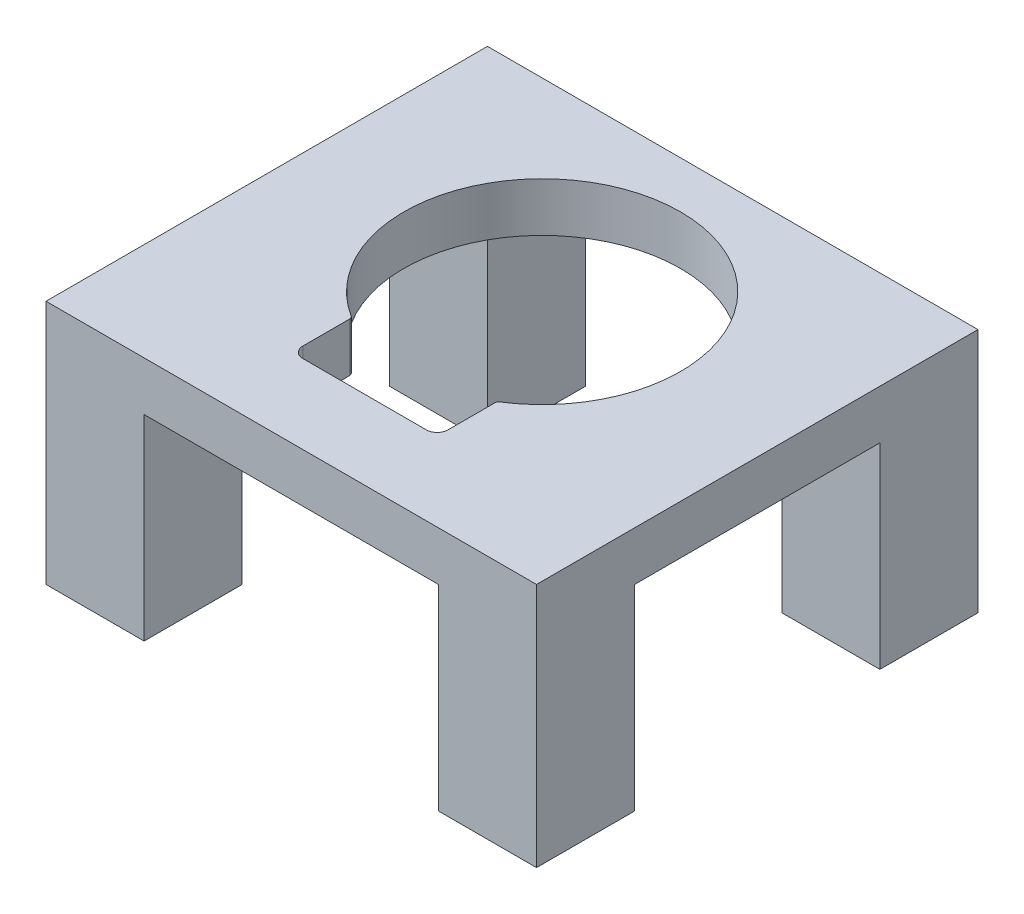
ISO-10303-21;
HEADER;
FILE_DESCRIPTION(('STEP AP214'),'2;1');
FILE_NAME('part.step','',(''),(''),'','','');
FILE_SCHEMA(('AUTOMOTIVE_DESIGN { 1 0 10303 214 1 1 1 1 }'));
ENDSEC;
DATA;
#1=APPLICATION_CONTEXT('core data for automotive mechanical design processes');
#2=APPLICATION_PROTOCOL_DEFINITION('international standard','automotive_design',2000,#1);
#3=PRODUCT_CONTEXT('',#1,'mechanical');
#4=PRODUCT('Part','Part','',(#3));
#5=PRODUCT_RELATED_PRODUCT_CATEGORY('part','',(#4));
#6=PRODUCT_DEFINITION_FORMATION('','',#4);
#7=PRODUCT_DEFINITION_CONTEXT('part definition',#1,'design');
#8=PRODUCT_DEFINITION('design','',#6,#7);
#9=PRODUCT_DEFINITION_SHAPE('','',#8);
#10=(LENGTH_UNIT() NAMED_UNIT(*) SI_UNIT(.MILLI.,.METRE.));
#11=(NAMED_UNIT(*) PLANE_ANGLE_UNIT() SI_UNIT($,.RADIAN.));
#12=(NAMED_UNIT(*) SI_UNIT($,.STERADIAN.) SOLID_ANGLE_UNIT());
#13=UNCERTAINTY_MEASURE_WITH_UNIT(LENGTH_MEASURE(1.E-05),#10,'distance_accuracy_value','');
#14=(GEOMETRIC_REPRESENTATION_CONTEXT(3) GLOBAL_UNCERTAINTY_ASSIGNED_CONTEXT((#13)) GLOBAL_UNIT_ASSIGNED_CONTEXT((#10,
#11,#12)) REPRESENTATION_CONTEXT('',''));
#15=CARTESIAN_POINT('',(0.,0.,0.));
#16=DIRECTION('',(0.,0.,1.));
#17=DIRECTION('',(1.,0.,0.));
#18=AXIS2_PLACEMENT_3D('',#15,#16,#17);
#19=CARTESIAN_POINT('',(0.,0.,0.));
#20=DIRECTION('',(0.,1.,0.));
#21=DIRECTION('',(0.,0.,1.));
#22=AXIS2_PLACEMENT_3D('',#19,#20,#21);
#23=PLANE('',#22);
#24=CARTESIAN_POINT('',(-6.3,0.,15.));
#25=DIRECTION('',(0.,1.,0.));
#26=DIRECTION('',(0.,0.,1.));
#27=AXIS2_PLACEMENT_3D('',#24,#25,#26);
#28=CIRCLE('',#27,1.1);
#29=CARTESIAN_POINT('',(-7.4,0.,15.));
#30=VERTEX_POINT('',#29);
#31=CARTESIAN_POINT('',(-6.3,0.,16.1));
#32=VERTEX_POINT('',#31);
#33=EDGE_CURVE('E291',#30,#32,#28,.T.);
#34=ORIENTED_EDGE('',*,*,#33,.T.);
#35=DIRECTION('',(1.,0.,0.));
#36=VECTOR('',#35,1.);
#37=CARTESIAN_POINT('',(6.3,0.,16.1));
#38=LINE('',#37,#36);
#39=CARTESIAN_POINT('',(6.3,0.,16.1));
#40=VERTEX_POINT('',#39);
#41=EDGE_CURVE('E313',#32,#40,#38,.T.);
#42=ORIENTED_EDGE('',*,*,#41,.T.);
#43=CARTESIAN_POINT('',(6.3,0.,15.));
#44=DIRECTION('',(0.,1.,0.));
#45=DIRECTION('',(0.,0.,1.));
#46=AXIS2_PLACEMENT_3D('',#43,#44,#45);
#47=CIRCLE('',#46,1.1);
#48=CARTESIAN_POINT('',(7.4,0.,15.));
#49=VERTEX_POINT('',#48);
#50=EDGE_CURVE('E316',#40,#49,#47,.T.);
#51=ORIENTED_EDGE('',*,*,#50,.T.);
#52=DIRECTION('',(0.,0.,-1.));
#53=VECTOR('',#52,1.);
#54=CARTESIAN_POINT('',(7.4,0.,10.2233383328778));
#55=LINE('',#54,#53);
#56=CARTESIAN_POINT('',(7.4,0.,10.2233383328778));
#57=VERTEX_POINT('',#56);
#58=EDGE_CURVE('E319',#49,#57,#55,.T.);
#59=ORIENTED_EDGE('',*,*,#58,.T.);
#60=CARTESIAN_POINT('',(7.8,0.,10.2233383328778));
#61=DIRECTION('',(0.,-1.,0.));
#62=DIRECTION('',(0.,0.,1.));
#63=AXIS2_PLACEMENT_3D('',#60,#61,#62);
#64=CIRCLE('',#63,0.400000000000001);
#65=CARTESIAN_POINT('',(7.58482758620689,0.,9.88614279266049));
#66=VERTEX_POINT('',#65);
#67=EDGE_CURVE('E322',#57,#66,#64,.T.);
#68=ORIENTED_EDGE('',*,*,#67,.T.);
#69=CARTESIAN_POINT('',(0.,0.,-2.));
#70=DIRECTION('',(0.,1.,0.));
#71=DIRECTION('',(0.,0.,1.));
#72=AXIS2_PLACEMENT_3D('',#69,#70,#71);
#73=CIRCLE('',#72,14.1);
#74=CARTESIAN_POINT('',(-7.5848275862069,0.,9.88614279266049));
#75=VERTEX_POINT('',#74);
#76=EDGE_CURVE('E325',#66,#75,#73,.T.);
#77=ORIENTED_EDGE('',*,*,#76,.T.);
#78=CARTESIAN_POINT('',(-7.8,0.,10.2233383328778));
#79=DIRECTION('',(0.,-1.,0.));
#80=DIRECTION('',(0.,0.,1.));
#81=AXIS2_PLACEMENT_3D('',#78,#79,#80);
#82=CIRCLE('',#81,0.4);
#83=CARTESIAN_POINT('',(-7.4,0.,10.2233383328778));
#84=VERTEX_POINT('',#83);
#85=EDGE_CURVE('E328',#75,#84,#82,.T.);
#86=ORIENTED_EDGE('',*,*,#85,.T.);
#87=DIRECTION('',(0.,0.,1.));
#88=VECTOR('',#87,1.);
#89=CARTESIAN_POINT('',(-7.4,0.,15.));
#90=LINE('',#89,#88);
#91=EDGE_CURVE('E295',#84,#30,#90,.T.);
#92=ORIENTED_EDGE('',*,*,#91,.T.);
#93=EDGE_LOOP('',(#34,#42,#51,#59,#68,#77,#86,#92));
#94=FACE_BOUND('',#93,.T.);
#95=DIRECTION('',(0.,0.,-1.));
#96=VECTOR('',#95,1.);
#97=CARTESIAN_POINT('',(15.5566662790766,0.,24.1308399843946));
#98=LINE('',#97,#96);
#99=CARTESIAN_POINT('',(15.5566662790766,0.,24.1308399843946));
#100=VERTEX_POINT('',#99);
#101=CARTESIAN_POINT('',(15.5566662790766,0.,14.1308399843946));
#102=VERTEX_POINT('',#101);
#103=EDGE_CURVE('E657',#100,#102,#98,.T.);
#104=ORIENTED_EDGE('',*,*,#103,.F.);
#105=DIRECTION('',(1.,0.,0.));
#106=VECTOR('',#105,1.);
#107=CARTESIAN_POINT('',(-24.4433337209234,0.,24.1308399843946));
#108=LINE('',#107,#106);
#109=CARTESIAN_POINT('',(-14.4433337209234,0.,24.1308399843946));
#110=VERTEX_POINT('',#109);
#111=EDGE_CURVE('E218',#110,#100,#108,.T.);
#112=ORIENTED_EDGE('',*,*,#111,.F.);
#113=DIRECTION('',(0.,0.,1.));
#114=VECTOR('',#113,1.);
#115=CARTESIAN_POINT('',(-14.4433337209234,0.,24.1308399843946));
#116=LINE('',#115,#114);
#117=CARTESIAN_POINT('',(-14.4433337209234,0.,14.1308399843946));
#118=VERTEX_POINT('',#117);
#119=EDGE_CURVE('E272',#118,#110,#116,.T.);
#120=ORIENTED_EDGE('',*,*,#119,.F.);
#121=DIRECTION('',(1.,0.,0.));
#122=VECTOR('',#121,1.);
#123=CARTESIAN_POINT('',(-24.4433337209234,0.,14.1308399843946));
#124=LINE('',#123,#122);
#125=CARTESIAN_POINT('',(-24.4433337209234,0.,14.1308399843946));
#126=VERTEX_POINT('',#125);
#127=EDGE_CURVE('E267',#126,#118,#124,.T.);
#128=ORIENTED_EDGE('',*,*,#127,.F.);
#129=DIRECTION('',(0.,0.,1.));
#130=VECTOR('',#129,1.);
#131=CARTESIAN_POINT('',(-24.4433337209234,0.,-20.8691600156054));
#132=LINE('',#131,#130);
#133=CARTESIAN_POINT('',(-24.4433337209234,0.,-10.8691600156054));
#134=VERTEX_POINT('',#133);
#135=EDGE_CURVE('E350',#134,#126,#132,.T.);
#136=ORIENTED_EDGE('',*,*,#135,.F.);
#137=DIRECTION('',(-1.,0.,0.));
#138=VECTOR('',#137,1.);
#139=CARTESIAN_POINT('',(-24.4433337209234,0.,-10.8691600156054));
#140=LINE('',#139,#138);
#141=CARTESIAN_POINT('',(-14.4433337209234,0.,-10.8691600156054));
#142=VERTEX_POINT('',#141);
#143=EDGE_CURVE('E249',#142,#134,#140,.T.);
#144=ORIENTED_EDGE('',*,*,#143,.F.);
#145=DIRECTION('',(0.,0.,1.));
#146=VECTOR('',#145,1.);
#147=CARTESIAN_POINT('',(-14.4433337209233,0.,-20.8691600156054));
#148=LINE('',#147,#146);
#149=CARTESIAN_POINT('',(-14.4433337209233,0.,-20.8691600156054));
#150=VERTEX_POINT('',#149);
#151=EDGE_CURVE('E244',#150,#142,#148,.T.);
#152=ORIENTED_EDGE('',*,*,#151,.F.);
#153=DIRECTION('',(-1.,0.,0.));
#154=VECTOR('',#153,1.);
#155=CARTESIAN_POINT('',(-24.4433337209234,0.,-20.8691600156054));
#156=LINE('',#155,#154);
#157=CARTESIAN_POINT('',(15.5566662790766,0.,-20.8691600156054));
#158=VERTEX_POINT('',#157);
#159=EDGE_CURVE('E355',#158,#150,#156,.T.);
#160=ORIENTED_EDGE('',*,*,#159,.F.);
#161=DIRECTION('',(0.,0.,-1.));
#162=VECTOR('',#161,1.);
#163=CARTESIAN_POINT('',(15.5566662790766,0.,-20.8691600156054));
#164=LINE('',#163,#162);
#165=CARTESIAN_POINT('',(15.5566662790766,0.,-10.8691600156054));
#166=VERTEX_POINT('',#165);
#167=EDGE_CURVE('E221',#166,#158,#164,.T.);
#168=ORIENTED_EDGE('',*,*,#167,.F.);
#169=DIRECTION('',(-1.,0.,0.));
#170=VECTOR('',#169,1.);
#171=CARTESIAN_POINT('',(25.5566662790766,0.,-10.8691600156054));
#172=LINE('',#171,#170);
#173=CARTESIAN_POINT('',(25.5566662790766,0.,-10.8691600156054));
#174=VERTEX_POINT('',#173);
#175=EDGE_CURVE('E219',#174,#166,#172,.T.);
#176=ORIENTED_EDGE('',*,*,#175,.F.);
#177=DIRECTION('',(0.,0.,-1.));
#178=VECTOR('',#177,1.);
#179=CARTESIAN_POINT('',(25.5566662790766,0.,-20.8691600156054));
#180=LINE('',#179,#178);
#181=CARTESIAN_POINT('',(25.5566662790766,0.,14.1308399843946));
#182=VERTEX_POINT('',#181);
#183=EDGE_CURVE('E364',#182,#174,#180,.T.);
#184=ORIENTED_EDGE('',*,*,#183,.F.);
#185=DIRECTION('',(1.,0.,0.));
#186=VECTOR('',#185,1.);
#187=CARTESIAN_POINT('',(25.5566662790766,0.,14.1308399843946));
#188=LINE('',#187,#186);
#189=EDGE_CURVE('E213',#102,#182,#188,.T.);
#190=ORIENTED_EDGE('',*,*,#189,.F.);
#191=EDGE_LOOP('',(#104,#112,#120,#128,#136,#144,#152,#160,#168,#176,#184,#190));
#192=FACE_BOUND('',#191,.T.);
#193=ADVANCED_FACE('F33',(#94,#192),#23,.F.);
#194=CARTESIAN_POINT('',(0.,5.,0.));
#195=DIRECTION('',(0.,1.,0.));
#196=DIRECTION('',(0.,0.,1.));
#197=AXIS2_PLACEMENT_3D('',#194,#195,#196);
#198=PLANE('',#197);
#199=DIRECTION('',(0.,0.,1.));
#200=VECTOR('',#199,1.);
#201=CARTESIAN_POINT('',(-24.4433337209234,5.,-20.8691600156054));
#202=LINE('',#201,#200);
#203=CARTESIAN_POINT('',(-24.4433337209234,5.,-20.8691600156054));
#204=VERTEX_POINT('',#203);
#205=CARTESIAN_POINT('',(-24.4433337209234,5.,24.1308399843946));
#206=VERTEX_POINT('',#205);
#207=EDGE_CURVE('E351',#204,#206,#202,.T.);
#208=ORIENTED_EDGE('',*,*,#207,.T.);
#209=DIRECTION('',(1.,0.,0.));
#210=VECTOR('',#209,1.);
#211=CARTESIAN_POINT('',(-24.4433337209234,5.,24.1308399843946));
#212=LINE('',#211,#210);
#213=CARTESIAN_POINT('',(25.5566662790766,5.,24.1308399843946));
#214=VERTEX_POINT('',#213);
#215=EDGE_CURVE('E354',#206,#214,#212,.T.);
#216=ORIENTED_EDGE('',*,*,#215,.T.);
#217=DIRECTION('',(0.,0.,-1.));
#218=VECTOR('',#217,1.);
#219=CARTESIAN_POINT('',(25.5566662790766,5.,-20.8691600156054));
#220=LINE('',#219,#218);
#221=CARTESIAN_POINT('',(25.5566662790766,5.,-20.8691600156054));
#222=VERTEX_POINT('',#221);
#223=EDGE_CURVE('E357',#214,#222,#220,.T.);
#224=ORIENTED_EDGE('',*,*,#223,.T.);
#225=DIRECTION('',(-1.,0.,0.));
#226=VECTOR('',#225,1.);
#227=CARTESIAN_POINT('',(-24.4433337209234,5.,-20.8691600156054));
#228=LINE('',#227,#226);
#229=EDGE_CURVE('E359',#222,#204,#228,.T.);
#230=ORIENTED_EDGE('',*,*,#229,.T.);
#231=EDGE_LOOP('',(#208,#216,#224,#230));
#232=FACE_BOUND('',#231,.T.);
#233=DIRECTION('',(1.,0.,0.));
#234=VECTOR('',#233,1.);
#235=CARTESIAN_POINT('',(6.3,5.,16.1));
#236=LINE('',#235,#234);
#237=CARTESIAN_POINT('',(-6.3,5.,16.1));
#238=VERTEX_POINT('',#237);
#239=CARTESIAN_POINT('',(6.3,5.,16.1));
#240=VERTEX_POINT('',#239);
#241=EDGE_CURVE('E294',#238,#240,#236,.T.);
#242=ORIENTED_EDGE('',*,*,#241,.F.);
#243=CARTESIAN_POINT('',(-6.3,5.,15.));
#244=DIRECTION('',(0.,1.,0.));
#245=DIRECTION('',(0.,0.,1.));
#246=AXIS2_PLACEMENT_3D('',#243,#244,#245);
#247=CIRCLE('',#246,1.1);
#248=CARTESIAN_POINT('',(-7.4,5.,15.));
#249=VERTEX_POINT('',#248);
#250=EDGE_CURVE('E292',#249,#238,#247,.T.);
#251=ORIENTED_EDGE('',*,*,#250,.F.);
#252=DIRECTION('',(0.,0.,1.));
#253=VECTOR('',#252,1.);
#254=CARTESIAN_POINT('',(-7.4,5.,15.));
#255=LINE('',#254,#253);
#256=CARTESIAN_POINT('',(-7.4,5.,10.2233383328778));
#257=VERTEX_POINT('',#256);
#258=EDGE_CURVE('E308',#257,#249,#255,.T.);
#259=ORIENTED_EDGE('',*,*,#258,.F.);
#260=CARTESIAN_POINT('',(-7.8,5.,10.2233383328778));
#261=DIRECTION('',(0.,-1.,0.));
#262=DIRECTION('',(0.,0.,1.));
#263=AXIS2_PLACEMENT_3D('',#260,#261,#262);
#264=CIRCLE('',#263,0.4);
#265=CARTESIAN_POINT('',(-7.5848275862069,5.,9.88614279266049));
#266=VERTEX_POINT('',#265);
#267=EDGE_CURVE('E305',#266,#257,#264,.T.);
#268=ORIENTED_EDGE('',*,*,#267,.F.);
#269=CARTESIAN_POINT('',(0.,5.,-2.));
#270=DIRECTION('',(0.,1.,0.));
#271=DIRECTION('',(0.,0.,1.));
#272=AXIS2_PLACEMENT_3D('',#269,#270,#271);
#273=CIRCLE('',#272,14.1);
#274=CARTESIAN_POINT('',(7.58482758620689,5.,9.88614279266049));
#275=VERTEX_POINT('',#274);
#276=EDGE_CURVE('E303',#275,#266,#273,.T.);
#277=ORIENTED_EDGE('',*,*,#276,.F.);
#278=CARTESIAN_POINT('',(7.8,5.,10.2233383328778));
#279=DIRECTION('',(0.,-1.,0.));
#280=DIRECTION('',(0.,0.,1.));
#281=AXIS2_PLACEMENT_3D('',#278,#279,#280);
#282=CIRCLE('',#281,0.400000000000001);
#283=CARTESIAN_POINT('',(7.4,5.,10.2233383328778));
#284=VERTEX_POINT('',#283);
#285=EDGE_CURVE('E301',#284,#275,#282,.T.);
#286=ORIENTED_EDGE('',*,*,#285,.F.);
#287=DIRECTION('',(0.,0.,-1.));
#288=VECTOR('',#287,1.);
#289=CARTESIAN_POINT('',(7.4,5.,10.2233383328778));
#290=LINE('',#289,#288);
#291=CARTESIAN_POINT('',(7.4,5.,15.));
#292=VERTEX_POINT('',#291);
#293=EDGE_CURVE('E299',#292,#284,#290,.T.);
#294=ORIENTED_EDGE('',*,*,#293,.F.);
#295=CARTESIAN_POINT('',(6.3,5.,15.));
#296=DIRECTION('',(0.,1.,0.));
#297=DIRECTION('',(0.,0.,1.));
#298=AXIS2_PLACEMENT_3D('',#295,#296,#297);
#299=CIRCLE('',#298,1.1);
#300=EDGE_CURVE('E297',#240,#292,#299,.T.);
#301=ORIENTED_EDGE('',*,*,#300,.F.);
#302=EDGE_LOOP('',(#242,#251,#259,#268,#277,#286,#294,#301));
#303=FACE_BOUND('',#302,.T.);
#304=ADVANCED_FACE('F376',(#232,#303),#198,.T.);
#305=CARTESIAN_POINT('',(-24.4433337209234,5.,-20.8691600156054));
#306=DIRECTION('',(1.,0.,0.));
#307=DIRECTION('',(0.,0.,-1.));
#308=AXIS2_PLACEMENT_3D('',#305,#306,#307);
#309=PLANE('',#308);
#310=DIRECTION('',(0.,-1.,0.));
#311=VECTOR('',#310,1.);
#312=CARTESIAN_POINT('',(-24.4433337209234,5.,-20.8691600156054));
#313=LINE('',#312,#311);
#314=CARTESIAN_POINT('',(-24.4433337209233,-20.,-20.8691600156054));
#315=VERTEX_POINT('',#314);
#316=EDGE_CURVE('E361',#204,#315,#313,.T.);
#317=ORIENTED_EDGE('',*,*,#316,.T.);
#318=DIRECTION('',(0.,0.,-1.));
#319=VECTOR('',#318,1.);
#320=CARTESIAN_POINT('',(-24.4433337209233,-20.,-20.8691600156054));
#321=LINE('',#320,#319);
#322=CARTESIAN_POINT('',(-24.4433337209234,-20.,-10.8691600156054));
#323=VERTEX_POINT('',#322);
#324=EDGE_CURVE('E253',#323,#315,#321,.T.);
#325=ORIENTED_EDGE('',*,*,#324,.F.);
#326=DIRECTION('',(0.,1.,0.));
#327=VECTOR('',#326,1.);
#328=CARTESIAN_POINT('',(-24.4433337209234,-20.,-10.8691600156054));
#329=LINE('',#328,#327);
#330=EDGE_CURVE('E256',#323,#134,#329,.T.);
#331=ORIENTED_EDGE('',*,*,#330,.T.);
#332=ORIENTED_EDGE('',*,*,#135,.T.);
#333=DIRECTION('',(0.,1.,0.));
#334=VECTOR('',#333,1.);
#335=CARTESIAN_POINT('',(-24.4433337209234,-20.,14.1308399843946));
#336=LINE('',#335,#334);
#337=CARTESIAN_POINT('',(-24.4433337209234,-20.,14.1308399843946));
#338=VERTEX_POINT('',#337);
#339=EDGE_CURVE('E288',#338,#126,#336,.T.);
#340=ORIENTED_EDGE('',*,*,#339,.F.);
#341=DIRECTION('',(0.,0.,-1.));
#342=VECTOR('',#341,1.);
#343=CARTESIAN_POINT('',(-24.4433337209234,-20.,24.1308399843946));
#344=LINE('',#343,#342);
#345=CARTESIAN_POINT('',(-24.4433337209234,-20.,24.1308399843946));
#346=VERTEX_POINT('',#345);
#347=EDGE_CURVE('E268',#346,#338,#344,.T.);
#348=ORIENTED_EDGE('',*,*,#347,.F.);
#349=DIRECTION('',(0.,-1.,0.));
#350=VECTOR('',#349,1.);
#351=CARTESIAN_POINT('',(-24.4433337209234,5.,24.1308399843946));
#352=LINE('',#351,#350);
#353=EDGE_CURVE('E11',#206,#346,#352,.T.);
#354=ORIENTED_EDGE('',*,*,#353,.F.);
#355=ORIENTED_EDGE('',*,*,#207,.F.);
#356=EDGE_LOOP('',(#317,#325,#331,#332,#340,#348,#354,#355));
#357=FACE_BOUND('',#356,.T.);
#358=ADVANCED_FACE('F35',(#357),#309,.F.);
#359=CARTESIAN_POINT('',(-24.4433337209234,5.,24.1308399843946));
#360=DIRECTION('',(0.,0.,-1.));
#361=DIRECTION('',(-1.,0.,0.));
#362=AXIS2_PLACEMENT_3D('',#359,#360,#361);
#363=PLANE('',#362);
#364=ORIENTED_EDGE('',*,*,#353,.T.);
#365=DIRECTION('',(-1.,0.,0.));
#366=VECTOR('',#365,1.);
#367=CARTESIAN_POINT('',(-24.4433337209234,-20.,24.1308399843946));
#368=LINE('',#367,#366);
#369=CARTESIAN_POINT('',(-14.4433337209234,-20.,24.1308399843946));
#370=VERTEX_POINT('',#369);
#371=EDGE_CURVE('E276',#370,#346,#368,.T.);
#372=ORIENTED_EDGE('',*,*,#371,.F.);
#373=DIRECTION('',(0.,1.,0.));
#374=VECTOR('',#373,1.);
#375=CARTESIAN_POINT('',(-14.4433337209234,-20.,24.1308399843946));
#376=LINE('',#375,#374);
#377=EDGE_CURVE('E279',#370,#110,#376,.T.);
#378=ORIENTED_EDGE('',*,*,#377,.T.);
#379=ORIENTED_EDGE('',*,*,#111,.T.);
#380=DIRECTION('',(0.,1.,0.));
#381=VECTOR('',#380,1.);
#382=CARTESIAN_POINT('',(15.5566662790766,-20.,24.1308399843946));
#383=LINE('',#382,#381);
#384=CARTESIAN_POINT('',(15.5566662790766,-20.,24.1308399843946));
#385=VERTEX_POINT('',#384);
#386=EDGE_CURVE('E198',#385,#100,#383,.T.);
#387=ORIENTED_EDGE('',*,*,#386,.F.);
#388=DIRECTION('',(-1.,0.,0.));
#389=VECTOR('',#388,1.);
#390=CARTESIAN_POINT('',(25.5566662790766,-20.,24.1308399843946));
#391=LINE('',#390,#389);
#392=CARTESIAN_POINT('',(25.5566662790766,-20.,24.1308399843946));
#393=VERTEX_POINT('',#392);
#394=EDGE_CURVE('E205',#393,#385,#391,.T.);
#395=ORIENTED_EDGE('',*,*,#394,.F.);
#396=DIRECTION('',(0.,-1.,0.));
#397=VECTOR('',#396,1.);
#398=CARTESIAN_POINT('',(25.5566662790766,5.,24.1308399843946));
#399=LINE('',#398,#397);
#400=EDGE_CURVE('E41',#214,#393,#399,.T.);
#401=ORIENTED_EDGE('',*,*,#400,.F.);
#402=ORIENTED_EDGE('',*,*,#215,.F.);
#403=EDGE_LOOP('',(#364,#372,#378,#379,#387,#395,#401,#402));
#404=FACE_BOUND('',#403,.T.);
#405=ADVANCED_FACE('F216',(#404),#363,.F.);
#406=CARTESIAN_POINT('',(25.5566662790766,5.,-20.8691600156054));
#407=DIRECTION('',(-1.,0.,0.));
#408=DIRECTION('',(0.,0.,1.));
#409=AXIS2_PLACEMENT_3D('',#406,#407,#408);
#410=PLANE('',#409);
#411=ORIENTED_EDGE('',*,*,#400,.T.);
#412=DIRECTION('',(0.,0.,1.));
#413=VECTOR('',#412,1.);
#414=CARTESIAN_POINT('',(25.5566662790766,-20.,24.1308399843946));
#415=LINE('',#414,#413);
#416=CARTESIAN_POINT('',(25.5566662790766,-20.,14.1308399843946));
#417=VERTEX_POINT('',#416);
#418=EDGE_CURVE('E210',#417,#393,#415,.T.);
#419=ORIENTED_EDGE('',*,*,#418,.F.);
#420=DIRECTION('',(0.,1.,0.));
#421=VECTOR('',#420,1.);
#422=CARTESIAN_POINT('',(25.5566662790766,-20.,14.1308399843946));
#423=LINE('',#422,#421);
#424=EDGE_CURVE('E48',#417,#182,#423,.T.);
#425=ORIENTED_EDGE('',*,*,#424,.T.);
#426=ORIENTED_EDGE('',*,*,#183,.T.);
#427=DIRECTION('',(0.,1.,0.));
#428=VECTOR('',#427,1.);
#429=CARTESIAN_POINT('',(25.5566662790766,-20.,-10.8691600156054));
#430=LINE('',#429,#428);
#431=CARTESIAN_POINT('',(25.5566662790766,-20.,-10.8691600156054));
#432=VERTEX_POINT('',#431);
#433=EDGE_CURVE('E241',#432,#174,#430,.T.);
#434=ORIENTED_EDGE('',*,*,#433,.F.);
#435=DIRECTION('',(0.,0.,1.));
#436=VECTOR('',#435,1.);
#437=CARTESIAN_POINT('',(25.5566662790766,-20.,-20.8691600156054));
#438=LINE('',#437,#436);
#439=CARTESIAN_POINT('',(25.5566662790766,-20.,-20.8691600156054));
#440=VERTEX_POINT('',#439);
#441=EDGE_CURVE('E226',#440,#432,#438,.T.);
#442=ORIENTED_EDGE('',*,*,#441,.F.);
#443=DIRECTION('',(0.,-1.,0.));
#444=VECTOR('',#443,1.);
#445=CARTESIAN_POINT('',(25.5566662790766,5.,-20.8691600156054));
#446=LINE('',#445,#444);
#447=EDGE_CURVE('E368',#222,#440,#446,.T.);
#448=ORIENTED_EDGE('',*,*,#447,.F.);
#449=ORIENTED_EDGE('',*,*,#223,.F.);
#450=EDGE_LOOP('',(#411,#419,#425,#426,#434,#442,#448,#449));
#451=FACE_BOUND('',#450,.T.);
#452=ADVANCED_FACE('F370',(#451),#410,.F.);
#453=CARTESIAN_POINT('',(-24.4433337209234,5.,-20.8691600156054));
#454=DIRECTION('',(0.,0.,1.));
#455=DIRECTION('',(1.,0.,0.));
#456=AXIS2_PLACEMENT_3D('',#453,#454,#455);
#457=PLANE('',#456);
#458=ORIENTED_EDGE('',*,*,#447,.T.);
#459=DIRECTION('',(1.,0.,0.));
#460=VECTOR('',#459,1.);
#461=CARTESIAN_POINT('',(25.5566662790766,-20.,-20.8691600156054));
#462=LINE('',#461,#460);
#463=CARTESIAN_POINT('',(15.5566662790766,-20.,-20.8691600156054));
#464=VERTEX_POINT('',#463);
#465=EDGE_CURVE('E233',#464,#440,#462,.T.);
#466=ORIENTED_EDGE('',*,*,#465,.F.);
#467=DIRECTION('',(0.,1.,0.));
#468=VECTOR('',#467,1.);
#469=CARTESIAN_POINT('',(15.5566662790766,-20.,-20.8691600156054));
#470=LINE('',#469,#468);
#471=EDGE_CURVE('E56',#464,#158,#470,.T.);
#472=ORIENTED_EDGE('',*,*,#471,.T.);
#473=ORIENTED_EDGE('',*,*,#159,.T.);
#474=DIRECTION('',(0.,1.,0.));
#475=VECTOR('',#474,1.);
#476=CARTESIAN_POINT('',(-14.4433337209233,-20.,-20.8691600156054));
#477=LINE('',#476,#475);
#478=CARTESIAN_POINT('',(-14.4433337209233,-20.,-20.8691600156054));
#479=VERTEX_POINT('',#478);
#480=EDGE_CURVE('E264',#479,#150,#477,.T.);
#481=ORIENTED_EDGE('',*,*,#480,.F.);
#482=DIRECTION('',(1.,0.,0.));
#483=VECTOR('',#482,1.);
#484=CARTESIAN_POINT('',(-24.4433337209233,-20.,-20.8691600156054));
#485=LINE('',#484,#483);
#486=EDGE_CURVE('E245',#315,#479,#485,.T.);
#487=ORIENTED_EDGE('',*,*,#486,.F.);
#488=ORIENTED_EDGE('',*,*,#316,.F.);
#489=ORIENTED_EDGE('',*,*,#229,.F.);
#490=EDGE_LOOP('',(#458,#466,#472,#473,#481,#487,#488,#489));
#491=FACE_BOUND('',#490,.T.);
#492=ADVANCED_FACE('F415',(#491),#457,.F.);
#493=CARTESIAN_POINT('',(-6.3,5.,15.));
#494=DIRECTION('',(0.,-1.,0.));
#495=DIRECTION('',(0.,0.,-1.));
#496=AXIS2_PLACEMENT_3D('',#493,#494,#495);
#497=CYLINDRICAL_SURFACE('',#496,1.1);
#498=ORIENTED_EDGE('',*,*,#33,.F.);
#499=DIRECTION('',(0.,-1.,0.));
#500=VECTOR('',#499,1.);
#501=CARTESIAN_POINT('',(-7.4,5.,15.));
#502=LINE('',#501,#500);
#503=EDGE_CURVE('E310',#249,#30,#502,.T.);
#504=ORIENTED_EDGE('',*,*,#503,.F.);
#505=ORIENTED_EDGE('',*,*,#250,.T.);
#506=DIRECTION('',(0.,-1.,0.));
#507=VECTOR('',#506,1.);
#508=CARTESIAN_POINT('',(-6.3,5.,16.1));
#509=LINE('',#508,#507);
#510=EDGE_CURVE('E347',#238,#32,#509,.T.);
#511=ORIENTED_EDGE('',*,*,#510,.T.);
#512=EDGE_LOOP('',(#498,#504,#505,#511));
#513=FACE_BOUND('',#512,.T.);
#514=ADVANCED_FACE('F418',(#513),#497,.F.);
#515=CARTESIAN_POINT('',(6.3,5.,16.1));
#516=DIRECTION('',(0.,0.,-1.));
#517=DIRECTION('',(-1.,0.,0.));
#518=AXIS2_PLACEMENT_3D('',#515,#516,#517);
#519=PLANE('',#518);
#520=ORIENTED_EDGE('',*,*,#41,.F.);
#521=ORIENTED_EDGE('',*,*,#510,.F.);
#522=ORIENTED_EDGE('',*,*,#241,.T.);
#523=DIRECTION('',(0.,-1.,0.));
#524=VECTOR('',#523,1.);
#525=CARTESIAN_POINT('',(6.3,5.,16.1));
#526=LINE('',#525,#524);
#527=EDGE_CURVE('E345',#240,#40,#526,.T.);
#528=ORIENTED_EDGE('',*,*,#527,.T.);
#529=EDGE_LOOP('',(#520,#521,#522,#528));
#530=FACE_BOUND('',#529,.T.);
#531=ADVANCED_FACE('F440',(#530),#519,.T.);
#532=CARTESIAN_POINT('',(6.3,5.,15.));
#533=DIRECTION('',(0.,-1.,0.));
#534=DIRECTION('',(0.,0.,-1.));
#535=AXIS2_PLACEMENT_3D('',#532,#533,#534);
#536=CYLINDRICAL_SURFACE('',#535,1.1);
#537=ORIENTED_EDGE('',*,*,#50,.F.);
#538=ORIENTED_EDGE('',*,*,#527,.F.);
#539=ORIENTED_EDGE('',*,*,#300,.T.);
#540=DIRECTION('',(0.,-1.,0.));
#541=VECTOR('',#540,1.);
#542=CARTESIAN_POINT('',(7.4,5.,15.));
#543=LINE('',#542,#541);
#544=EDGE_CURVE('E343',#292,#49,#543,.T.);
#545=ORIENTED_EDGE('',*,*,#544,.T.);
#546=EDGE_LOOP('',(#537,#538,#539,#545));
#547=FACE_BOUND('',#546,.T.);
#548=ADVANCED_FACE('F450',(#547),#536,.F.);
#549=CARTESIAN_POINT('',(7.4,5.,10.2233383328778));
#550=DIRECTION('',(-1.,0.,0.));
#551=DIRECTION('',(0.,0.,1.));
#552=AXIS2_PLACEMENT_3D('',#549,#550,#551);
#553=PLANE('',#552);
#554=ORIENTED_EDGE('',*,*,#58,.F.);
#555=ORIENTED_EDGE('',*,*,#544,.F.);
#556=ORIENTED_EDGE('',*,*,#293,.T.);
#557=DIRECTION('',(0.,-1.,0.));
#558=VECTOR('',#557,1.);
#559=CARTESIAN_POINT('',(7.4,5.,10.2233383328778));
#560=LINE('',#559,#558);
#561=EDGE_CURVE('E341',#284,#57,#560,.T.);
#562=ORIENTED_EDGE('',*,*,#561,.T.);
#563=EDGE_LOOP('',(#554,#555,#556,#562));
#564=FACE_BOUND('',#563,.T.);
#565=ADVANCED_FACE('F460',(#564),#553,.T.);
#566=CARTESIAN_POINT('',(7.8,5.,10.2233383328778));
#567=DIRECTION('',(0.,-1.,0.));
#568=DIRECTION('',(0.,0.,-1.));
#569=AXIS2_PLACEMENT_3D('',#566,#567,#568);
#570=CYLINDRICAL_SURFACE('',#569,0.400000000000001);
#571=ORIENTED_EDGE('',*,*,#67,.F.);
#572=ORIENTED_EDGE('',*,*,#561,.F.);
#573=ORIENTED_EDGE('',*,*,#285,.T.);
#574=DIRECTION('',(0.,-1.,0.));
#575=VECTOR('',#574,1.);
#576=CARTESIAN_POINT('',(7.58482758620689,5.,9.88614279266049));
#577=LINE('',#576,#575);
#578=EDGE_CURVE('E339',#275,#66,#577,.T.);
#579=ORIENTED_EDGE('',*,*,#578,.T.);
#580=EDGE_LOOP('',(#571,#572,#573,#579));
#581=FACE_BOUND('',#580,.T.);
#582=ADVANCED_FACE('F470',(#581),#570,.T.);
#583=CARTESIAN_POINT('',(0.,5.,-2.));
#584=DIRECTION('',(0.,-1.,0.));
#585=DIRECTION('',(0.,0.,-1.));
#586=AXIS2_PLACEMENT_3D('',#583,#584,#585);
#587=CYLINDRICAL_SURFACE('',#586,14.1);
#588=ORIENTED_EDGE('',*,*,#76,.F.);
#589=ORIENTED_EDGE('',*,*,#578,.F.);
#590=ORIENTED_EDGE('',*,*,#276,.T.);
#591=DIRECTION('',(0.,-1.,0.));
#592=VECTOR('',#591,1.);
#593=CARTESIAN_POINT('',(-7.5848275862069,5.,9.88614279266049));
#594=LINE('',#593,#592);
#595=EDGE_CURVE('E337',#266,#75,#594,.T.);
#596=ORIENTED_EDGE('',*,*,#595,.T.);
#597=EDGE_LOOP('',(#588,#589,#590,#596));
#598=FACE_BOUND('',#597,.T.);
#599=ADVANCED_FACE('F480',(#598),#587,.F.);
#600=CARTESIAN_POINT('',(-7.8,5.,10.2233383328778));
#601=DIRECTION('',(0.,-1.,0.));
#602=DIRECTION('',(0.,0.,-1.));
#603=AXIS2_PLACEMENT_3D('',#600,#601,#602);
#604=CYLINDRICAL_SURFACE('',#603,0.4);
#605=ORIENTED_EDGE('',*,*,#85,.F.);
#606=ORIENTED_EDGE('',*,*,#595,.F.);
#607=ORIENTED_EDGE('',*,*,#267,.T.);
#608=DIRECTION('',(0.,-1.,0.));
#609=VECTOR('',#608,1.);
#610=CARTESIAN_POINT('',(-7.4,5.,10.2233383328778));
#611=LINE('',#610,#609);
#612=EDGE_CURVE('E335',#257,#84,#611,.T.);
#613=ORIENTED_EDGE('',*,*,#612,.T.);
#614=EDGE_LOOP('',(#605,#606,#607,#613));
#615=FACE_BOUND('',#614,.T.);
#616=ADVANCED_FACE('F403',(#615),#604,.T.);
#617=CARTESIAN_POINT('',(-7.4,5.,15.));
#618=DIRECTION('',(1.,0.,0.));
#619=DIRECTION('',(0.,0.,-1.));
#620=AXIS2_PLACEMENT_3D('',#617,#618,#619);
#621=PLANE('',#620);
#622=ORIENTED_EDGE('',*,*,#91,.F.);
#623=ORIENTED_EDGE('',*,*,#612,.F.);
#624=ORIENTED_EDGE('',*,*,#258,.T.);
#625=ORIENTED_EDGE('',*,*,#503,.T.);
#626=EDGE_LOOP('',(#622,#623,#624,#625));
#627=FACE_BOUND('',#626,.T.);
#628=ADVANCED_FACE('F396',(#627),#621,.T.);
#629=CARTESIAN_POINT('',(-24.4433337209234,-20.,14.1308399843946));
#630=DIRECTION('',(0.,0.,1.));
#631=DIRECTION('',(1.,0.,0.));
#632=AXIS2_PLACEMENT_3D('',#629,#630,#631);
#633=PLANE('',#632);
#634=ORIENTED_EDGE('',*,*,#127,.T.);
#635=DIRECTION('',(0.,1.,0.));
#636=VECTOR('',#635,1.);
#637=CARTESIAN_POINT('',(-14.4433337209234,-20.,14.1308399843946));
#638=LINE('',#637,#636);
#639=CARTESIAN_POINT('',(-14.4433337209234,-20.,14.1308399843946));
#640=VERTEX_POINT('',#639);
#641=EDGE_CURVE('E285',#640,#118,#638,.T.);
#642=ORIENTED_EDGE('',*,*,#641,.F.);
#643=DIRECTION('',(1.,0.,0.));
#644=VECTOR('',#643,1.);
#645=CARTESIAN_POINT('',(-24.4433337209234,-20.,14.1308399843946));
#646=LINE('',#645,#644);
#647=EDGE_CURVE('E271',#338,#640,#646,.T.);
#648=ORIENTED_EDGE('',*,*,#647,.F.);
#649=ORIENTED_EDGE('',*,*,#339,.T.);
#650=EDGE_LOOP('',(#634,#642,#648,#649));
#651=FACE_BOUND('',#650,.T.);
#652=ADVANCED_FACE('F394',(#651),#633,.F.);
#653=CARTESIAN_POINT('',(-14.4433337209234,-20.,24.1308399843946));
#654=DIRECTION('',(-1.,0.,0.));
#655=DIRECTION('',(0.,0.,1.));
#656=AXIS2_PLACEMENT_3D('',#653,#654,#655);
#657=PLANE('',#656);
#658=ORIENTED_EDGE('',*,*,#119,.T.);
#659=ORIENTED_EDGE('',*,*,#377,.F.);
#660=DIRECTION('',(0.,0.,1.));
#661=VECTOR('',#660,1.);
#662=CARTESIAN_POINT('',(-14.4433337209234,-20.,24.1308399843946));
#663=LINE('',#662,#661);
#664=EDGE_CURVE('E274',#640,#370,#663,.T.);
#665=ORIENTED_EDGE('',*,*,#664,.F.);
#666=ORIENTED_EDGE('',*,*,#641,.T.);
#667=EDGE_LOOP('',(#658,#659,#665,#666));
#668=FACE_BOUND('',#667,.T.);
#669=ADVANCED_FACE('F389',(#668),#657,.F.);
#670=CARTESIAN_POINT('',(0.,-20.,0.));
#671=DIRECTION('',(0.,-1.,0.));
#672=DIRECTION('',(0.,0.,-1.));
#673=AXIS2_PLACEMENT_3D('',#670,#671,#672);
#674=PLANE('',#673);
#675=ORIENTED_EDGE('',*,*,#347,.T.);
#676=ORIENTED_EDGE('',*,*,#647,.T.);
#677=ORIENTED_EDGE('',*,*,#664,.T.);
#678=ORIENTED_EDGE('',*,*,#371,.T.);
#679=EDGE_LOOP('',(#675,#676,#677,#678));
#680=FACE_BOUND('',#679,.T.);
#681=ADVANCED_FACE('F384',(#680),#674,.T.);
#682=CARTESIAN_POINT('',(-14.4433337209233,-20.,-20.8691600156054));
#683=DIRECTION('',(-1.,0.,0.));
#684=DIRECTION('',(0.,0.,1.));
#685=AXIS2_PLACEMENT_3D('',#682,#683,#684);
#686=PLANE('',#685);
#687=ORIENTED_EDGE('',*,*,#151,.T.);
#688=DIRECTION('',(0.,1.,0.));
#689=VECTOR('',#688,1.);
#690=CARTESIAN_POINT('',(-14.4433337209234,-20.,-10.8691600156054));
#691=LINE('',#690,#689);
#692=CARTESIAN_POINT('',(-14.4433337209234,-20.,-10.8691600156054));
#693=VERTEX_POINT('',#692);
#694=EDGE_CURVE('E261',#693,#142,#691,.T.);
#695=ORIENTED_EDGE('',*,*,#694,.F.);
#696=DIRECTION('',(0.,0.,1.));
#697=VECTOR('',#696,1.);
#698=CARTESIAN_POINT('',(-14.4433337209233,-20.,-20.8691600156054));
#699=LINE('',#698,#697);
#700=EDGE_CURVE('E248',#479,#693,#699,.T.);
#701=ORIENTED_EDGE('',*,*,#700,.F.);
#702=ORIENTED_EDGE('',*,*,#480,.T.);
#703=EDGE_LOOP('',(#687,#695,#701,#702));
#704=FACE_BOUND('',#703,.T.);
#705=ADVANCED_FACE('F566',(#704),#686,.F.);
#706=CARTESIAN_POINT('',(-24.4433337209234,-20.,-10.8691600156054));
#707=DIRECTION('',(0.,0.,-1.));
#708=DIRECTION('',(-1.,0.,0.));
#709=AXIS2_PLACEMENT_3D('',#706,#707,#708);
#710=PLANE('',#709);
#711=ORIENTED_EDGE('',*,*,#143,.T.);
#712=ORIENTED_EDGE('',*,*,#330,.F.);
#713=DIRECTION('',(-1.,0.,0.));
#714=VECTOR('',#713,1.);
#715=CARTESIAN_POINT('',(-24.4433337209234,-20.,-10.8691600156054));
#716=LINE('',#715,#714);
#717=EDGE_CURVE('E251',#693,#323,#716,.T.);
#718=ORIENTED_EDGE('',*,*,#717,.F.);
#719=ORIENTED_EDGE('',*,*,#694,.T.);
#720=EDGE_LOOP('',(#711,#712,#718,#719));
#721=FACE_BOUND('',#720,.T.);
#722=ADVANCED_FACE('F574',(#721),#710,.F.);
#723=CARTESIAN_POINT('',(0.,-20.,0.));
#724=DIRECTION('',(0.,-1.,0.));
#725=DIRECTION('',(0.,0.,-1.));
#726=AXIS2_PLACEMENT_3D('',#723,#724,#725);
#727=PLANE('',#726);
#728=ORIENTED_EDGE('',*,*,#486,.T.);
#729=ORIENTED_EDGE('',*,*,#700,.T.);
#730=ORIENTED_EDGE('',*,*,#717,.T.);
#731=ORIENTED_EDGE('',*,*,#324,.T.);
#732=EDGE_LOOP('',(#728,#729,#730,#731));
#733=FACE_BOUND('',#732,.T.);
#734=ADVANCED_FACE('F583',(#733),#727,.T.);
#735=CARTESIAN_POINT('',(25.5566662790766,-20.,-10.8691600156054));
#736=DIRECTION('',(0.,0.,-1.));
#737=DIRECTION('',(-1.,0.,0.));
#738=AXIS2_PLACEMENT_3D('',#735,#736,#737);
#739=PLANE('',#738);
#740=ORIENTED_EDGE('',*,*,#175,.T.);
#741=DIRECTION('',(0.,1.,0.));
#742=VECTOR('',#741,1.);
#743=CARTESIAN_POINT('',(15.5566662790766,-20.,-10.8691600156054));
#744=LINE('',#743,#742);
#745=CARTESIAN_POINT('',(15.5566662790766,-20.,-10.8691600156054));
#746=VERTEX_POINT('',#745);
#747=EDGE_CURVE('E238',#746,#166,#744,.T.);
#748=ORIENTED_EDGE('',*,*,#747,.F.);
#749=DIRECTION('',(-1.,0.,0.));
#750=VECTOR('',#749,1.);
#751=CARTESIAN_POINT('',(25.5566662790766,-20.,-10.8691600156054));
#752=LINE('',#751,#750);
#753=EDGE_CURVE('E229',#432,#746,#752,.T.);
#754=ORIENTED_EDGE('',*,*,#753,.F.);
#755=ORIENTED_EDGE('',*,*,#433,.T.);
#756=EDGE_LOOP('',(#740,#748,#754,#755));
#757=FACE_BOUND('',#756,.T.);
#758=ADVANCED_FACE('F592',(#757),#739,.F.);
#759=CARTESIAN_POINT('',(15.5566662790766,-20.,-20.8691600156054));
#760=DIRECTION('',(1.,0.,0.));
#761=DIRECTION('',(0.,0.,-1.));
#762=AXIS2_PLACEMENT_3D('',#759,#760,#761);
#763=PLANE('',#762);
#764=ORIENTED_EDGE('',*,*,#167,.T.);
#765=ORIENTED_EDGE('',*,*,#471,.F.);
#766=DIRECTION('',(0.,0.,-1.));
#767=VECTOR('',#766,1.);
#768=CARTESIAN_POINT('',(15.5566662790766,-20.,-20.8691600156054));
#769=LINE('',#768,#767);
#770=EDGE_CURVE('E231',#746,#464,#769,.T.);
#771=ORIENTED_EDGE('',*,*,#770,.F.);
#772=ORIENTED_EDGE('',*,*,#747,.T.);
#773=EDGE_LOOP('',(#764,#765,#771,#772));
#774=FACE_BOUND('',#773,.T.);
#775=ADVANCED_FACE('F601',(#774),#763,.F.);
#776=CARTESIAN_POINT('',(0.,-20.,0.));
#777=DIRECTION('',(0.,-1.,0.));
#778=DIRECTION('',(0.,0.,-1.));
#779=AXIS2_PLACEMENT_3D('',#776,#777,#778);
#780=PLANE('',#779);
#781=ORIENTED_EDGE('',*,*,#441,.T.);
#782=ORIENTED_EDGE('',*,*,#753,.T.);
#783=ORIENTED_EDGE('',*,*,#770,.T.);
#784=ORIENTED_EDGE('',*,*,#465,.T.);
#785=EDGE_LOOP('',(#781,#782,#783,#784));
#786=FACE_BOUND('',#785,.T.);
#787=ADVANCED_FACE('F610',(#786),#780,.T.);
#788=CARTESIAN_POINT('',(15.5566662790766,-20.,24.1308399843946));
#789=DIRECTION('',(1.,0.,0.));
#790=DIRECTION('',(0.,0.,-1.));
#791=AXIS2_PLACEMENT_3D('',#788,#789,#790);
#792=PLANE('',#791);
#793=ORIENTED_EDGE('',*,*,#103,.T.);
#794=DIRECTION('',(0.,1.,0.));
#795=VECTOR('',#794,1.);
#796=CARTESIAN_POINT('',(15.5566662790766,-20.,14.1308399843946));
#797=LINE('',#796,#795);
#798=CARTESIAN_POINT('',(15.5566662790766,-20.,14.1308399843946));
#799=VERTEX_POINT('',#798);
#800=EDGE_CURVE('E201',#799,#102,#797,.T.);
#801=ORIENTED_EDGE('',*,*,#800,.F.);
#802=DIRECTION('',(0.,0.,-1.));
#803=VECTOR('',#802,1.);
#804=CARTESIAN_POINT('',(15.5566662790766,-20.,24.1308399843946));
#805=LINE('',#804,#803);
#806=EDGE_CURVE('E194',#385,#799,#805,.T.);
#807=ORIENTED_EDGE('',*,*,#806,.F.);
#808=ORIENTED_EDGE('',*,*,#386,.T.);
#809=EDGE_LOOP('',(#793,#801,#807,#808));
#810=FACE_BOUND('',#809,.T.);
#811=ADVANCED_FACE('F196',(#810),#792,.F.);
#812=CARTESIAN_POINT('',(25.5566662790766,-20.,14.1308399843946));
#813=DIRECTION('',(0.,0.,1.));
#814=DIRECTION('',(1.,0.,0.));
#815=AXIS2_PLACEMENT_3D('',#812,#813,#814);
#816=PLANE('',#815);
#817=ORIENTED_EDGE('',*,*,#189,.T.);
#818=ORIENTED_EDGE('',*,*,#424,.F.);
#819=DIRECTION('',(1.,0.,0.));
#820=VECTOR('',#819,1.);
#821=CARTESIAN_POINT('',(25.5566662790766,-20.,14.1308399843946));
#822=LINE('',#821,#820);
#823=EDGE_CURVE('E204',#799,#417,#822,.T.);
#824=ORIENTED_EDGE('',*,*,#823,.F.);
#825=ORIENTED_EDGE('',*,*,#800,.T.);
#826=EDGE_LOOP('',(#817,#818,#824,#825));
#827=FACE_BOUND('',#826,.T.);
#828=ADVANCED_FACE('F627',(#827),#816,.F.);
#829=CARTESIAN_POINT('',(0.,-20.,0.));
#830=DIRECTION('',(0.,-1.,0.));
#831=DIRECTION('',(0.,0.,-1.));
#832=AXIS2_PLACEMENT_3D('',#829,#830,#831);
#833=PLANE('',#832);
#834=ORIENTED_EDGE('',*,*,#394,.T.);
#835=ORIENTED_EDGE('',*,*,#806,.T.);
#836=ORIENTED_EDGE('',*,*,#823,.T.);
#837=ORIENTED_EDGE('',*,*,#418,.T.);
#838=EDGE_LOOP('',(#834,#835,#836,#837));
#839=FACE_BOUND('',#838,.T.);
#840=ADVANCED_FACE('F209',(#839),#833,.T.);
#841=CLOSED_SHELL('',(#193,#304,#358,#405,#452,#492,#514,#531,#548,#565,#582,#599,#616,#628,
#652,#669,#681,#705,#722,#734,#758,#775,#787,#811,#828,#840));
#842=MANIFOLD_SOLID_BREP('B2',#841);
#843=ADVANCED_BREP_SHAPE_REPRESENTATION('',(#18,#842),#14);
#844=SHAPE_DEFINITION_REPRESENTATION(#9,#843);
ENDSEC;
END-ISO-10303-21;
